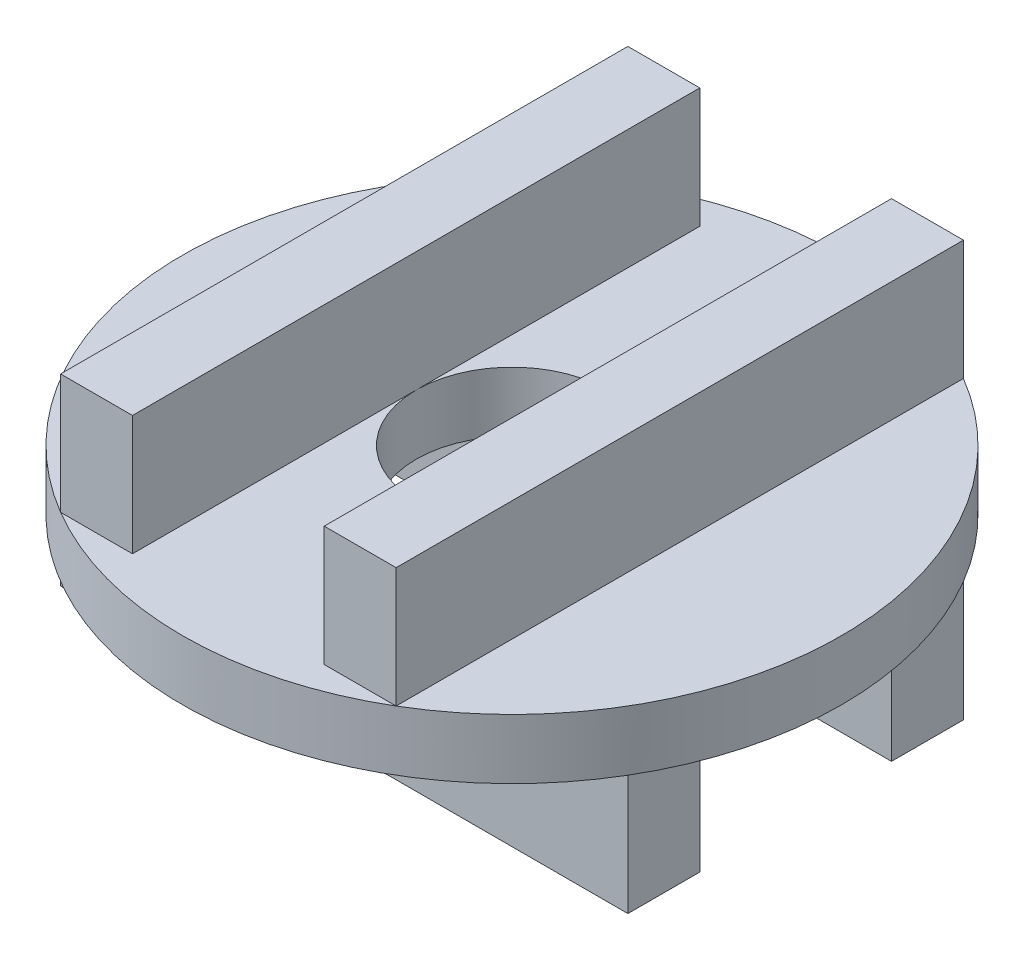
ISO-10303-21;
HEADER;
FILE_DESCRIPTION(('STEP AP214'),'2;1');
FILE_NAME('part.step','',(''),(''),'','','');
FILE_SCHEMA(('AUTOMOTIVE_DESIGN { 1 0 10303 214 1 1 1 1 }'));
ENDSEC;
DATA;
#1=APPLICATION_CONTEXT('core data for automotive mechanical design processes');
#2=APPLICATION_PROTOCOL_DEFINITION('international standard','automotive_design',2000,#1);
#3=PRODUCT_CONTEXT('',#1,'mechanical');
#4=PRODUCT('Part','Part','',(#3));
#5=PRODUCT_RELATED_PRODUCT_CATEGORY('part','',(#4));
#6=PRODUCT_DEFINITION_FORMATION('','',#4);
#7=PRODUCT_DEFINITION_CONTEXT('part definition',#1,'design');
#8=PRODUCT_DEFINITION('design','',#6,#7);
#9=PRODUCT_DEFINITION_SHAPE('','',#8);
#10=(LENGTH_UNIT() NAMED_UNIT(*) SI_UNIT(.MILLI.,.METRE.));
#11=(NAMED_UNIT(*) PLANE_ANGLE_UNIT() SI_UNIT($,.RADIAN.));
#12=(NAMED_UNIT(*) SI_UNIT($,.STERADIAN.) SOLID_ANGLE_UNIT());
#13=UNCERTAINTY_MEASURE_WITH_UNIT(LENGTH_MEASURE(1.E-05),#10,'distance_accuracy_value','');
#14=(GEOMETRIC_REPRESENTATION_CONTEXT(3) GLOBAL_UNCERTAINTY_ASSIGNED_CONTEXT((#13)) GLOBAL_UNIT_ASSIGNED_CONTEXT((#10,
#11,#12)) REPRESENTATION_CONTEXT('',''));
#15=CARTESIAN_POINT('',(0.,0.,0.));
#16=DIRECTION('',(0.,0.,1.));
#17=DIRECTION('',(1.,0.,0.));
#18=AXIS2_PLACEMENT_3D('',#15,#16,#17);
#19=CARTESIAN_POINT('',(0.,0.,0.));
#20=DIRECTION('',(0.,1.,0.));
#21=DIRECTION('',(0.,0.,1.));
#22=AXIS2_PLACEMENT_3D('',#19,#20,#21);
#23=PLANE('',#22);
#24=CARTESIAN_POINT('',(0.,0.,0.));
#25=DIRECTION('',(0.,1.,0.));
#26=DIRECTION('',(0.,0.,1.));
#27=AXIS2_PLACEMENT_3D('',#24,#25,#26);
#28=CIRCLE('',#27,55.);
#29=CARTESIAN_POINT('',(-47.3392015141785,0.,28.));
#30=VERTEX_POINT('',#29);
#31=CARTESIAN_POINT('',(47.3392015141785,0.,28.));
#32=VERTEX_POINT('',#31);
#33=EDGE_CURVE('E313',#30,#32,#28,.T.);
#34=ORIENTED_EDGE('',*,*,#33,.F.);
#35=DIRECTION('',(1.,0.,0.));
#36=VECTOR('',#35,1.);
#37=CARTESIAN_POINT('',(0.,0.,28.));
#38=LINE('',#37,#36);
#39=EDGE_CURVE('E177',#30,#32,#38,.T.);
#40=ORIENTED_EDGE('',*,*,#39,.T.);
#41=EDGE_LOOP('',(#34,#40));
#42=FACE_BOUND('',#41,.T.);
#43=ADVANCED_FACE('F43',(#42),#23,.F.);
#44=CARTESIAN_POINT('',(47.3392015141785,0.,-28.));
#45=VERTEX_POINT('',#44);
#46=EDGE_CURVE('E50',#32,#45,#28,.T.);
#47=ORIENTED_EDGE('',*,*,#46,.F.);
#48=DIRECTION('',(0.,0.,-1.));
#49=VECTOR('',#48,1.);
#50=CARTESIAN_POINT('',(47.3392015141785,0.,0.));
#51=LINE('',#50,#49);
#52=CARTESIAN_POINT('',(47.3392015141785,0.,16.));
#53=VERTEX_POINT('',#52);
#54=EDGE_CURVE('E61',#32,#53,#51,.T.);
#55=ORIENTED_EDGE('',*,*,#54,.T.);
#56=DIRECTION('',(-1.,0.,0.));
#57=VECTOR('',#56,1.);
#58=CARTESIAN_POINT('',(0.,0.,16.));
#59=LINE('',#58,#57);
#60=CARTESIAN_POINT('',(0.,0.,16.));
#61=VERTEX_POINT('',#60);
#62=EDGE_CURVE('E53',#53,#61,#59,.T.);
#63=ORIENTED_EDGE('',*,*,#62,.T.);
#64=CARTESIAN_POINT('',(0.,0.,0.));
#65=DIRECTION('',(0.,1.,0.));
#66=DIRECTION('',(0.,0.,1.));
#67=AXIS2_PLACEMENT_3D('',#64,#65,#66);
#68=CIRCLE('',#67,16.);
#69=CARTESIAN_POINT('',(0.,0.,-16.));
#70=VERTEX_POINT('',#69);
#71=EDGE_CURVE('E311',#61,#70,#68,.T.);
#72=ORIENTED_EDGE('',*,*,#71,.T.);
#73=DIRECTION('',(-1.,0.,0.));
#74=VECTOR('',#73,1.);
#75=CARTESIAN_POINT('',(0.,0.,-16.));
#76=LINE('',#75,#74);
#77=CARTESIAN_POINT('',(47.3392015141785,0.,-16.));
#78=VERTEX_POINT('',#77);
#79=EDGE_CURVE('E216',#78,#70,#76,.T.);
#80=ORIENTED_EDGE('',*,*,#79,.F.);
#81=DIRECTION('',(0.,0.,1.));
#82=VECTOR('',#81,1.);
#83=CARTESIAN_POINT('',(47.3392015141785,0.,0.));
#84=LINE('',#83,#82);
#85=EDGE_CURVE('E230',#45,#78,#84,.T.);
#86=ORIENTED_EDGE('',*,*,#85,.F.);
#87=EDGE_LOOP('',(#47,#55,#63,#72,#80,#86));
#88=FACE_BOUND('',#87,.T.);
#89=ADVANCED_FACE('F341',(#88),#23,.F.);
#90=EDGE_CURVE('E277',#70,#61,#68,.T.);
#91=ORIENTED_EDGE('',*,*,#90,.T.);
#92=CARTESIAN_POINT('',(-47.3392015141785,0.,16.));
#93=VERTEX_POINT('',#92);
#94=EDGE_CURVE('E11',#61,#93,#59,.T.);
#95=ORIENTED_EDGE('',*,*,#94,.T.);
#96=DIRECTION('',(0.,0.,-1.));
#97=VECTOR('',#96,1.);
#98=CARTESIAN_POINT('',(-47.3392015141785,0.,0.));
#99=LINE('',#98,#97);
#100=EDGE_CURVE('E202',#30,#93,#99,.T.);
#101=ORIENTED_EDGE('',*,*,#100,.F.);
#102=CARTESIAN_POINT('',(-47.3392015141785,0.,-28.));
#103=VERTEX_POINT('',#102);
#104=EDGE_CURVE('E331',#103,#30,#28,.T.);
#105=ORIENTED_EDGE('',*,*,#104,.F.);
#106=DIRECTION('',(0.,0.,1.));
#107=VECTOR('',#106,1.);
#108=CARTESIAN_POINT('',(-47.3392015141785,0.,0.));
#109=LINE('',#108,#107);
#110=CARTESIAN_POINT('',(-47.3392015141785,0.,-16.));
#111=VERTEX_POINT('',#110);
#112=EDGE_CURVE('E68',#103,#111,#109,.T.);
#113=ORIENTED_EDGE('',*,*,#112,.T.);
#114=EDGE_CURVE('E55',#70,#111,#76,.T.);
#115=ORIENTED_EDGE('',*,*,#114,.F.);
#116=EDGE_LOOP('',(#91,#95,#101,#105,#113,#115));
#117=FACE_BOUND('',#116,.T.);
#118=ADVANCED_FACE('F337',(#117),#23,.F.);
#119=DIRECTION('',(1.,0.,0.));
#120=VECTOR('',#119,1.);
#121=CARTESIAN_POINT('',(0.,0.,-28.));
#122=LINE('',#121,#120);
#123=EDGE_CURVE('E221',#103,#45,#122,.T.);
#124=ORIENTED_EDGE('',*,*,#123,.F.);
#125=EDGE_CURVE('E328',#45,#103,#28,.T.);
#126=ORIENTED_EDGE('',*,*,#125,.F.);
#127=EDGE_LOOP('',(#124,#126));
#128=FACE_BOUND('',#127,.T.);
#129=ADVANCED_FACE('F345',(#128),#23,.F.);
#130=CARTESIAN_POINT('',(0.,10.,0.));
#131=DIRECTION('',(0.,1.,0.));
#132=DIRECTION('',(0.,0.,1.));
#133=AXIS2_PLACEMENT_3D('',#130,#131,#132);
#134=PLANE('',#133);
#135=DIRECTION('',(1.,0.,0.));
#136=VECTOR('',#135,1.);
#137=CARTESIAN_POINT('',(0.,10.,-47.3392015141785));
#138=LINE('',#137,#136);
#139=CARTESIAN_POINT('',(-28.,10.,-47.3392015141785));
#140=VERTEX_POINT('',#139);
#141=CARTESIAN_POINT('',(-16.,10.,-47.3392015141785));
#142=VERTEX_POINT('',#141);
#143=EDGE_CURVE('E256',#140,#142,#138,.T.);
#144=ORIENTED_EDGE('',*,*,#143,.T.);
#145=DIRECTION('',(0.,0.,1.));
#146=VECTOR('',#145,1.);
#147=CARTESIAN_POINT('',(-16.,10.,0.));
#148=LINE('',#147,#146);
#149=CARTESIAN_POINT('',(-16.,10.,0.));
#150=VERTEX_POINT('',#149);
#151=EDGE_CURVE('E254',#142,#150,#148,.T.);
#152=ORIENTED_EDGE('',*,*,#151,.T.);
#153=CARTESIAN_POINT('',(0.,10.,0.));
#154=DIRECTION('',(0.,1.,0.));
#155=DIRECTION('',(0.,0.,1.));
#156=AXIS2_PLACEMENT_3D('',#153,#154,#155);
#157=CIRCLE('',#156,16.);
#158=CARTESIAN_POINT('',(16.,10.,0.));
#159=VERTEX_POINT('',#158);
#160=EDGE_CURVE('E306',#159,#150,#157,.T.);
#161=ORIENTED_EDGE('',*,*,#160,.F.);
#162=DIRECTION('',(0.,0.,-1.));
#163=VECTOR('',#162,1.);
#164=CARTESIAN_POINT('',(16.,10.,0.));
#165=LINE('',#164,#163);
#166=CARTESIAN_POINT('',(16.,10.,-47.3392015141785));
#167=VERTEX_POINT('',#166);
#168=EDGE_CURVE('E291',#159,#167,#165,.T.);
#169=ORIENTED_EDGE('',*,*,#168,.T.);
#170=DIRECTION('',(-1.,0.,0.));
#171=VECTOR('',#170,1.);
#172=CARTESIAN_POINT('',(0.,10.,-47.3392015141785));
#173=LINE('',#172,#171);
#174=CARTESIAN_POINT('',(28.,10.,-47.3392015141785));
#175=VERTEX_POINT('',#174);
#176=EDGE_CURVE('E281',#175,#167,#173,.T.);
#177=ORIENTED_EDGE('',*,*,#176,.F.);
#178=CARTESIAN_POINT('',(0.,10.,0.));
#179=DIRECTION('',(0.,1.,0.));
#180=DIRECTION('',(0.,0.,1.));
#181=AXIS2_PLACEMENT_3D('',#178,#179,#180);
#182=CIRCLE('',#181,55.);
#183=EDGE_CURVE('E320',#175,#140,#182,.T.);
#184=ORIENTED_EDGE('',*,*,#183,.T.);
#185=EDGE_LOOP('',(#144,#152,#161,#169,#177,#184));
#186=FACE_BOUND('',#185,.T.);
#187=ADVANCED_FACE('F348',(#186),#134,.T.);
#188=EDGE_CURVE('E315',#150,#159,#157,.T.);
#189=ORIENTED_EDGE('',*,*,#188,.F.);
#190=CARTESIAN_POINT('',(-16.,10.,47.3392015141785));
#191=VERTEX_POINT('',#190);
#192=EDGE_CURVE('E257',#150,#191,#148,.T.);
#193=ORIENTED_EDGE('',*,*,#192,.T.);
#194=DIRECTION('',(1.,0.,0.));
#195=VECTOR('',#194,1.);
#196=CARTESIAN_POINT('',(0.,10.,47.3392015141785));
#197=LINE('',#196,#195);
#198=CARTESIAN_POINT('',(-28.,10.,47.3392015141785));
#199=VERTEX_POINT('',#198);
#200=EDGE_CURVE('E249',#199,#191,#197,.T.);
#201=ORIENTED_EDGE('',*,*,#200,.F.);
#202=CARTESIAN_POINT('',(28.,10.,47.3392015141785));
#203=VERTEX_POINT('',#202);
#204=EDGE_CURVE('E318',#199,#203,#182,.T.);
#205=ORIENTED_EDGE('',*,*,#204,.T.);
#206=DIRECTION('',(-1.,0.,0.));
#207=VECTOR('',#206,1.);
#208=CARTESIAN_POINT('',(0.,10.,47.3392015141785));
#209=LINE('',#208,#207);
#210=CARTESIAN_POINT('',(16.,10.,47.3392015141785));
#211=VERTEX_POINT('',#210);
#212=EDGE_CURVE('E295',#203,#211,#209,.T.);
#213=ORIENTED_EDGE('',*,*,#212,.T.);
#214=EDGE_CURVE('E181',#211,#159,#165,.T.);
#215=ORIENTED_EDGE('',*,*,#214,.T.);
#216=EDGE_LOOP('',(#189,#193,#201,#205,#213,#215));
#217=FACE_BOUND('',#216,.T.);
#218=ADVANCED_FACE('F356',(#217),#134,.T.);
#219=EDGE_CURVE('E323',#140,#199,#182,.T.);
#220=ORIENTED_EDGE('',*,*,#219,.T.);
#221=DIRECTION('',(0.,0.,-1.));
#222=VECTOR('',#221,1.);
#223=CARTESIAN_POINT('',(-28.,10.,0.));
#224=LINE('',#223,#222);
#225=EDGE_CURVE('E263',#199,#140,#224,.T.);
#226=ORIENTED_EDGE('',*,*,#225,.T.);
#227=EDGE_LOOP('',(#220,#226));
#228=FACE_BOUND('',#227,.T.);
#229=ADVANCED_FACE('F394',(#228),#134,.T.);
#230=EDGE_CURVE('E312',#203,#175,#182,.T.);
#231=ORIENTED_EDGE('',*,*,#230,.T.);
#232=DIRECTION('',(0.,0.,1.));
#233=VECTOR('',#232,1.);
#234=CARTESIAN_POINT('',(28.,10.,0.));
#235=LINE('',#234,#233);
#236=EDGE_CURVE('E296',#175,#203,#235,.T.);
#237=ORIENTED_EDGE('',*,*,#236,.T.);
#238=EDGE_LOOP('',(#231,#237));
#239=FACE_BOUND('',#238,.T.);
#240=ADVANCED_FACE('F358',(#239),#134,.T.);
#241=CARTESIAN_POINT('',(0.,10.,0.));
#242=DIRECTION('',(0.,-1.,0.));
#243=DIRECTION('',(0.,0.,-1.));
#244=AXIS2_PLACEMENT_3D('',#241,#242,#243);
#245=CYLINDRICAL_SURFACE('',#244,55.);
#246=ORIENTED_EDGE('',*,*,#230,.F.);
#247=ORIENTED_EDGE('',*,*,#204,.F.);
#248=ORIENTED_EDGE('',*,*,#219,.F.);
#249=ORIENTED_EDGE('',*,*,#183,.F.);
#250=EDGE_LOOP('',(#246,#247,#248,#249));
#251=FACE_BOUND('',#250,.T.);
#252=ORIENTED_EDGE('',*,*,#46,.T.);
#253=ORIENTED_EDGE('',*,*,#125,.T.);
#254=ORIENTED_EDGE('',*,*,#104,.T.);
#255=ORIENTED_EDGE('',*,*,#33,.T.);
#256=EDGE_LOOP('',(#252,#253,#254,#255));
#257=FACE_BOUND('',#256,.T.);
#258=ADVANCED_FACE('F44',(#251,#257),#245,.T.);
#259=CARTESIAN_POINT('',(0.,10.,0.));
#260=DIRECTION('',(0.,-1.,0.));
#261=DIRECTION('',(0.,0.,-1.));
#262=AXIS2_PLACEMENT_3D('',#259,#260,#261);
#263=CYLINDRICAL_SURFACE('',#262,16.);
#264=ORIENTED_EDGE('',*,*,#160,.T.);
#265=ORIENTED_EDGE('',*,*,#188,.T.);
#266=EDGE_LOOP('',(#264,#265));
#267=FACE_BOUND('',#266,.T.);
#268=ORIENTED_EDGE('',*,*,#71,.F.);
#269=ORIENTED_EDGE('',*,*,#90,.F.);
#270=EDGE_LOOP('',(#268,#269));
#271=FACE_BOUND('',#270,.T.);
#272=ADVANCED_FACE('F400',(#267,#271),#263,.F.);
#273=CARTESIAN_POINT('',(16.,30.,0.));
#274=DIRECTION('',(-1.,0.,0.));
#275=DIRECTION('',(0.,0.,1.));
#276=AXIS2_PLACEMENT_3D('',#273,#274,#275);
#277=PLANE('',#276);
#278=ORIENTED_EDGE('',*,*,#214,.F.);
#279=DIRECTION('',(0.,-1.,0.));
#280=VECTOR('',#279,1.);
#281=CARTESIAN_POINT('',(16.,30.,47.3392015141785));
#282=LINE('',#281,#280);
#283=CARTESIAN_POINT('',(16.,30.,47.3392015141785));
#284=VERTEX_POINT('',#283);
#285=EDGE_CURVE('E259',#284,#211,#282,.T.);
#286=ORIENTED_EDGE('',*,*,#285,.F.);
#287=DIRECTION('',(0.,0.,-1.));
#288=VECTOR('',#287,1.);
#289=CARTESIAN_POINT('',(16.,30.,0.));
#290=LINE('',#289,#288);
#291=CARTESIAN_POINT('',(16.,30.,-47.3392015141785));
#292=VERTEX_POINT('',#291);
#293=EDGE_CURVE('E280',#284,#292,#290,.T.);
#294=ORIENTED_EDGE('',*,*,#293,.T.);
#295=DIRECTION('',(0.,-1.,0.));
#296=VECTOR('',#295,1.);
#297=CARTESIAN_POINT('',(16.,30.,-47.3392015141785));
#298=LINE('',#297,#296);
#299=EDGE_CURVE('E288',#292,#167,#298,.T.);
#300=ORIENTED_EDGE('',*,*,#299,.T.);
#301=ORIENTED_EDGE('',*,*,#168,.F.);
#302=EDGE_LOOP('',(#278,#286,#294,#300,#301));
#303=FACE_BOUND('',#302,.T.);
#304=ADVANCED_FACE('F405',(#303),#277,.T.);
#305=CARTESIAN_POINT('',(0.,30.,47.3392015141785));
#306=DIRECTION('',(0.,0.,1.));
#307=DIRECTION('',(1.,0.,0.));
#308=AXIS2_PLACEMENT_3D('',#305,#306,#307);
#309=PLANE('',#308);
#310=ORIENTED_EDGE('',*,*,#212,.F.);
#311=DIRECTION('',(0.,-1.,0.));
#312=VECTOR('',#311,1.);
#313=CARTESIAN_POINT('',(28.,30.,47.3392015141785));
#314=LINE('',#313,#312);
#315=CARTESIAN_POINT('',(28.,30.,47.3392015141785));
#316=VERTEX_POINT('',#315);
#317=EDGE_CURVE('E303',#316,#203,#314,.T.);
#318=ORIENTED_EDGE('',*,*,#317,.F.);
#319=DIRECTION('',(-1.,0.,0.));
#320=VECTOR('',#319,1.);
#321=CARTESIAN_POINT('',(0.,30.,47.3392015141785));
#322=LINE('',#321,#320);
#323=EDGE_CURVE('E278',#316,#284,#322,.T.);
#324=ORIENTED_EDGE('',*,*,#323,.T.);
#325=ORIENTED_EDGE('',*,*,#285,.T.);
#326=EDGE_LOOP('',(#310,#318,#324,#325));
#327=FACE_BOUND('',#326,.T.);
#328=ADVANCED_FACE('F411',(#327),#309,.T.);
#329=CARTESIAN_POINT('',(28.,30.,0.));
#330=DIRECTION('',(1.,0.,0.));
#331=DIRECTION('',(0.,0.,-1.));
#332=AXIS2_PLACEMENT_3D('',#329,#330,#331);
#333=PLANE('',#332);
#334=ORIENTED_EDGE('',*,*,#236,.F.);
#335=DIRECTION('',(0.,-1.,0.));
#336=VECTOR('',#335,1.);
#337=CARTESIAN_POINT('',(28.,30.,-47.3392015141785));
#338=LINE('',#337,#336);
#339=CARTESIAN_POINT('',(28.,30.,-47.3392015141785));
#340=VERTEX_POINT('',#339);
#341=EDGE_CURVE('E301',#340,#175,#338,.T.);
#342=ORIENTED_EDGE('',*,*,#341,.F.);
#343=DIRECTION('',(0.,0.,1.));
#344=VECTOR('',#343,1.);
#345=CARTESIAN_POINT('',(28.,30.,0.));
#346=LINE('',#345,#344);
#347=EDGE_CURVE('E283',#340,#316,#346,.T.);
#348=ORIENTED_EDGE('',*,*,#347,.T.);
#349=ORIENTED_EDGE('',*,*,#317,.T.);
#350=EDGE_LOOP('',(#334,#342,#348,#349));
#351=FACE_BOUND('',#350,.T.);
#352=ADVANCED_FACE('F418',(#351),#333,.T.);
#353=CARTESIAN_POINT('',(0.,30.,-47.3392015141785));
#354=DIRECTION('',(0.,0.,1.));
#355=DIRECTION('',(1.,0.,0.));
#356=AXIS2_PLACEMENT_3D('',#353,#354,#355);
#357=PLANE('',#356);
#358=ORIENTED_EDGE('',*,*,#176,.T.);
#359=ORIENTED_EDGE('',*,*,#299,.F.);
#360=DIRECTION('',(-1.,0.,0.));
#361=VECTOR('',#360,1.);
#362=CARTESIAN_POINT('',(0.,30.,-47.3392015141785));
#363=LINE('',#362,#361);
#364=EDGE_CURVE('E286',#340,#292,#363,.T.);
#365=ORIENTED_EDGE('',*,*,#364,.F.);
#366=ORIENTED_EDGE('',*,*,#341,.T.);
#367=EDGE_LOOP('',(#358,#359,#365,#366));
#368=FACE_BOUND('',#367,.T.);
#369=ADVANCED_FACE('F419',(#368),#357,.F.);
#370=CARTESIAN_POINT('',(0.,30.,0.));
#371=DIRECTION('',(0.,1.,0.));
#372=DIRECTION('',(0.,0.,1.));
#373=AXIS2_PLACEMENT_3D('',#370,#371,#372);
#374=PLANE('',#373);
#375=ORIENTED_EDGE('',*,*,#293,.F.);
#376=ORIENTED_EDGE('',*,*,#323,.F.);
#377=ORIENTED_EDGE('',*,*,#347,.F.);
#378=ORIENTED_EDGE('',*,*,#364,.T.);
#379=EDGE_LOOP('',(#375,#376,#377,#378));
#380=FACE_BOUND('',#379,.T.);
#381=ADVANCED_FACE('F424',(#380),#374,.T.);
#382=CARTESIAN_POINT('',(-16.,30.,0.));
#383=DIRECTION('',(1.,0.,0.));
#384=DIRECTION('',(0.,0.,-1.));
#385=AXIS2_PLACEMENT_3D('',#382,#383,#384);
#386=PLANE('',#385);
#387=ORIENTED_EDGE('',*,*,#151,.F.);
#388=DIRECTION('',(0.,-1.,0.));
#389=VECTOR('',#388,1.);
#390=CARTESIAN_POINT('',(-16.,30.,-47.3392015141785));
#391=LINE('',#390,#389);
#392=CARTESIAN_POINT('',(-16.,30.,-47.3392015141785));
#393=VERTEX_POINT('',#392);
#394=EDGE_CURVE('E272',#393,#142,#391,.T.);
#395=ORIENTED_EDGE('',*,*,#394,.F.);
#396=DIRECTION('',(0.,0.,1.));
#397=VECTOR('',#396,1.);
#398=CARTESIAN_POINT('',(-16.,30.,0.));
#399=LINE('',#398,#397);
#400=CARTESIAN_POINT('',(-16.,30.,47.3392015141785));
#401=VERTEX_POINT('',#400);
#402=EDGE_CURVE('E245',#393,#401,#399,.T.);
#403=ORIENTED_EDGE('',*,*,#402,.T.);
#404=DIRECTION('',(0.,-1.,0.));
#405=VECTOR('',#404,1.);
#406=CARTESIAN_POINT('',(-16.,30.,47.3392015141785));
#407=LINE('',#406,#405);
#408=EDGE_CURVE('E255',#401,#191,#407,.T.);
#409=ORIENTED_EDGE('',*,*,#408,.T.);
#410=ORIENTED_EDGE('',*,*,#192,.F.);
#411=EDGE_LOOP('',(#387,#395,#403,#409,#410));
#412=FACE_BOUND('',#411,.T.);
#413=ADVANCED_FACE('F382',(#412),#386,.T.);
#414=CARTESIAN_POINT('',(0.,30.,-47.3392015141785));
#415=DIRECTION('',(0.,0.,-1.));
#416=DIRECTION('',(-1.,0.,0.));
#417=AXIS2_PLACEMENT_3D('',#414,#415,#416);
#418=PLANE('',#417);
#419=ORIENTED_EDGE('',*,*,#143,.F.);
#420=DIRECTION('',(0.,-1.,0.));
#421=VECTOR('',#420,1.);
#422=CARTESIAN_POINT('',(-28.,30.,-47.3392015141785));
#423=LINE('',#422,#421);
#424=CARTESIAN_POINT('',(-28.,30.,-47.3392015141785));
#425=VERTEX_POINT('',#424);
#426=EDGE_CURVE('E271',#425,#140,#423,.T.);
#427=ORIENTED_EDGE('',*,*,#426,.F.);
#428=DIRECTION('',(1.,0.,0.));
#429=VECTOR('',#428,1.);
#430=CARTESIAN_POINT('',(0.,30.,-47.3392015141785));
#431=LINE('',#430,#429);
#432=EDGE_CURVE('E244',#425,#393,#431,.T.);
#433=ORIENTED_EDGE('',*,*,#432,.T.);
#434=ORIENTED_EDGE('',*,*,#394,.T.);
#435=EDGE_LOOP('',(#419,#427,#433,#434));
#436=FACE_BOUND('',#435,.T.);
#437=ADVANCED_FACE('F388',(#436),#418,.T.);
#438=CARTESIAN_POINT('',(-28.,30.,0.));
#439=DIRECTION('',(-1.,0.,0.));
#440=DIRECTION('',(0.,0.,1.));
#441=AXIS2_PLACEMENT_3D('',#438,#439,#440);
#442=PLANE('',#441);
#443=ORIENTED_EDGE('',*,*,#225,.F.);
#444=DIRECTION('',(0.,-1.,0.));
#445=VECTOR('',#444,1.);
#446=CARTESIAN_POINT('',(-28.,30.,47.3392015141785));
#447=LINE('',#446,#445);
#448=CARTESIAN_POINT('',(-28.,30.,47.3392015141785));
#449=VERTEX_POINT('',#448);
#450=EDGE_CURVE('E267',#449,#199,#447,.T.);
#451=ORIENTED_EDGE('',*,*,#450,.F.);
#452=DIRECTION('',(0.,0.,-1.));
#453=VECTOR('',#452,1.);
#454=CARTESIAN_POINT('',(-28.,30.,0.));
#455=LINE('',#454,#453);
#456=EDGE_CURVE('E248',#449,#425,#455,.T.);
#457=ORIENTED_EDGE('',*,*,#456,.T.);
#458=ORIENTED_EDGE('',*,*,#426,.T.);
#459=EDGE_LOOP('',(#443,#451,#457,#458));
#460=FACE_BOUND('',#459,.T.);
#461=ADVANCED_FACE('F433',(#460),#442,.T.);
#462=CARTESIAN_POINT('',(0.,30.,47.3392015141785));
#463=DIRECTION('',(0.,0.,-1.));
#464=DIRECTION('',(-1.,0.,0.));
#465=AXIS2_PLACEMENT_3D('',#462,#463,#464);
#466=PLANE('',#465);
#467=ORIENTED_EDGE('',*,*,#200,.T.);
#468=ORIENTED_EDGE('',*,*,#408,.F.);
#469=DIRECTION('',(1.,0.,0.));
#470=VECTOR('',#469,1.);
#471=CARTESIAN_POINT('',(0.,30.,47.3392015141785));
#472=LINE('',#471,#470);
#473=EDGE_CURVE('E252',#449,#401,#472,.T.);
#474=ORIENTED_EDGE('',*,*,#473,.F.);
#475=ORIENTED_EDGE('',*,*,#450,.T.);
#476=EDGE_LOOP('',(#467,#468,#474,#475));
#477=FACE_BOUND('',#476,.T.);
#478=ADVANCED_FACE('F436',(#477),#466,.F.);
#479=CARTESIAN_POINT('',(0.,30.,0.));
#480=DIRECTION('',(0.,1.,0.));
#481=DIRECTION('',(0.,0.,1.));
#482=AXIS2_PLACEMENT_3D('',#479,#480,#481);
#483=PLANE('',#482);
#484=ORIENTED_EDGE('',*,*,#402,.F.);
#485=ORIENTED_EDGE('',*,*,#432,.F.);
#486=ORIENTED_EDGE('',*,*,#456,.F.);
#487=ORIENTED_EDGE('',*,*,#473,.T.);
#488=EDGE_LOOP('',(#484,#485,#486,#487));
#489=FACE_BOUND('',#488,.T.);
#490=ADVANCED_FACE('F438',(#489),#483,.T.);
#491=CARTESIAN_POINT('',(-47.3392015141785,-20.,0.));
#492=DIRECTION('',(-1.,0.,0.));
#493=DIRECTION('',(0.,0.,1.));
#494=AXIS2_PLACEMENT_3D('',#491,#492,#493);
#495=PLANE('',#494);
#496=ORIENTED_EDGE('',*,*,#112,.F.);
#497=DIRECTION('',(0.,1.,0.));
#498=VECTOR('',#497,1.);
#499=CARTESIAN_POINT('',(-47.3392015141785,-20.,-28.));
#500=LINE('',#499,#498);
#501=CARTESIAN_POINT('',(-47.3392015141785,-20.,-28.));
#502=VERTEX_POINT('',#501);
#503=EDGE_CURVE('E206',#502,#103,#500,.T.);
#504=ORIENTED_EDGE('',*,*,#503,.F.);
#505=DIRECTION('',(0.,0.,1.));
#506=VECTOR('',#505,1.);
#507=CARTESIAN_POINT('',(-47.3392015141785,-20.,0.));
#508=LINE('',#507,#506);
#509=CARTESIAN_POINT('',(-47.3392015141785,-20.,-16.));
#510=VERTEX_POINT('',#509);
#511=EDGE_CURVE('E215',#502,#510,#508,.T.);
#512=ORIENTED_EDGE('',*,*,#511,.T.);
#513=DIRECTION('',(0.,1.,0.));
#514=VECTOR('',#513,1.);
#515=CARTESIAN_POINT('',(-47.3392015141785,-20.,-16.));
#516=LINE('',#515,#514);
#517=EDGE_CURVE('E225',#510,#111,#516,.T.);
#518=ORIENTED_EDGE('',*,*,#517,.T.);
#519=EDGE_LOOP('',(#496,#504,#512,#518));
#520=FACE_BOUND('',#519,.T.);
#521=ADVANCED_FACE('F374',(#520),#495,.T.);
#522=CARTESIAN_POINT('',(0.,-20.,-28.));
#523=DIRECTION('',(0.,0.,1.));
#524=DIRECTION('',(1.,0.,0.));
#525=AXIS2_PLACEMENT_3D('',#522,#523,#524);
#526=PLANE('',#525);
#527=ORIENTED_EDGE('',*,*,#123,.T.);
#528=DIRECTION('',(0.,1.,0.));
#529=VECTOR('',#528,1.);
#530=CARTESIAN_POINT('',(47.3392015141785,-20.,-28.));
#531=LINE('',#530,#529);
#532=CARTESIAN_POINT('',(47.3392015141785,-20.,-28.));
#533=VERTEX_POINT('',#532);
#534=EDGE_CURVE('E240',#533,#45,#531,.T.);
#535=ORIENTED_EDGE('',*,*,#534,.F.);
#536=DIRECTION('',(1.,0.,0.));
#537=VECTOR('',#536,1.);
#538=CARTESIAN_POINT('',(0.,-20.,-28.));
#539=LINE('',#538,#537);
#540=EDGE_CURVE('E214',#502,#533,#539,.T.);
#541=ORIENTED_EDGE('',*,*,#540,.F.);
#542=ORIENTED_EDGE('',*,*,#503,.T.);
#543=EDGE_LOOP('',(#527,#535,#541,#542));
#544=FACE_BOUND('',#543,.T.);
#545=ADVANCED_FACE('F361',(#544),#526,.F.);
#546=CARTESIAN_POINT('',(47.3392015141785,-20.,0.));
#547=DIRECTION('',(-1.,0.,0.));
#548=DIRECTION('',(0.,0.,1.));
#549=AXIS2_PLACEMENT_3D('',#546,#547,#548);
#550=PLANE('',#549);
#551=ORIENTED_EDGE('',*,*,#85,.T.);
#552=DIRECTION('',(0.,1.,0.));
#553=VECTOR('',#552,1.);
#554=CARTESIAN_POINT('',(47.3392015141785,-20.,-16.));
#555=LINE('',#554,#553);
#556=CARTESIAN_POINT('',(47.3392015141785,-20.,-16.));
#557=VERTEX_POINT('',#556);
#558=EDGE_CURVE('E233',#557,#78,#555,.T.);
#559=ORIENTED_EDGE('',*,*,#558,.F.);
#560=DIRECTION('',(0.,0.,1.));
#561=VECTOR('',#560,1.);
#562=CARTESIAN_POINT('',(47.3392015141785,-20.,0.));
#563=LINE('',#562,#561);
#564=EDGE_CURVE('E217',#533,#557,#563,.T.);
#565=ORIENTED_EDGE('',*,*,#564,.F.);
#566=ORIENTED_EDGE('',*,*,#534,.T.);
#567=EDGE_LOOP('',(#551,#559,#565,#566));
#568=FACE_BOUND('',#567,.T.);
#569=ADVANCED_FACE('F370',(#568),#550,.F.);
#570=CARTESIAN_POINT('',(0.,-20.,-16.));
#571=DIRECTION('',(0.,0.,-1.));
#572=DIRECTION('',(-1.,0.,0.));
#573=AXIS2_PLACEMENT_3D('',#570,#571,#572);
#574=PLANE('',#573);
#575=ORIENTED_EDGE('',*,*,#79,.T.);
#576=ORIENTED_EDGE('',*,*,#114,.T.);
#577=ORIENTED_EDGE('',*,*,#517,.F.);
#578=DIRECTION('',(-1.,0.,0.));
#579=VECTOR('',#578,1.);
#580=CARTESIAN_POINT('',(0.,-20.,-16.));
#581=LINE('',#580,#579);
#582=EDGE_CURVE('E219',#557,#510,#581,.T.);
#583=ORIENTED_EDGE('',*,*,#582,.F.);
#584=ORIENTED_EDGE('',*,*,#558,.T.);
#585=EDGE_LOOP('',(#575,#576,#577,#583,#584));
#586=FACE_BOUND('',#585,.T.);
#587=ADVANCED_FACE('F380',(#586),#574,.F.);
#588=CARTESIAN_POINT('',(0.,-20.,0.));
#589=DIRECTION('',(0.,-1.,0.));
#590=DIRECTION('',(0.,0.,-1.));
#591=AXIS2_PLACEMENT_3D('',#588,#589,#590);
#592=PLANE('',#591);
#593=ORIENTED_EDGE('',*,*,#511,.F.);
#594=ORIENTED_EDGE('',*,*,#540,.T.);
#595=ORIENTED_EDGE('',*,*,#564,.T.);
#596=ORIENTED_EDGE('',*,*,#582,.T.);
#597=EDGE_LOOP('',(#593,#594,#595,#596));
#598=FACE_BOUND('',#597,.T.);
#599=ADVANCED_FACE('F375',(#598),#592,.T.);
#600=CARTESIAN_POINT('',(0.,-20.,28.));
#601=DIRECTION('',(0.,0.,1.));
#602=DIRECTION('',(1.,0.,0.));
#603=AXIS2_PLACEMENT_3D('',#600,#601,#602);
#604=PLANE('',#603);
#605=ORIENTED_EDGE('',*,*,#39,.F.);
#606=DIRECTION('',(0.,1.,0.));
#607=VECTOR('',#606,1.);
#608=CARTESIAN_POINT('',(-47.3392015141785,-20.,28.));
#609=LINE('',#608,#607);
#610=CARTESIAN_POINT('',(-47.3392015141785,-20.,28.));
#611=VERTEX_POINT('',#610);
#612=EDGE_CURVE('E172',#611,#30,#609,.T.);
#613=ORIENTED_EDGE('',*,*,#612,.F.);
#614=DIRECTION('',(1.,0.,0.));
#615=VECTOR('',#614,1.);
#616=CARTESIAN_POINT('',(0.,-20.,28.));
#617=LINE('',#616,#615);
#618=CARTESIAN_POINT('',(47.3392015141785,-20.,28.));
#619=VERTEX_POINT('',#618);
#620=EDGE_CURVE('E180',#611,#619,#617,.T.);
#621=ORIENTED_EDGE('',*,*,#620,.T.);
#622=DIRECTION('',(0.,1.,0.));
#623=VECTOR('',#622,1.);
#624=CARTESIAN_POINT('',(47.3392015141785,-20.,28.));
#625=LINE('',#624,#623);
#626=EDGE_CURVE('E201',#619,#32,#625,.T.);
#627=ORIENTED_EDGE('',*,*,#626,.T.);
#628=EDGE_LOOP('',(#605,#613,#621,#627));
#629=FACE_BOUND('',#628,.T.);
#630=ADVANCED_FACE('F174',(#629),#604,.T.);
#631=CARTESIAN_POINT('',(-47.3392015141785,-20.,0.));
#632=DIRECTION('',(1.,0.,0.));
#633=DIRECTION('',(0.,0.,-1.));
#634=AXIS2_PLACEMENT_3D('',#631,#632,#633);
#635=PLANE('',#634);
#636=ORIENTED_EDGE('',*,*,#100,.T.);
#637=DIRECTION('',(0.,1.,0.));
#638=VECTOR('',#637,1.);
#639=CARTESIAN_POINT('',(-47.3392015141785,-20.,16.));
#640=LINE('',#639,#638);
#641=CARTESIAN_POINT('',(-47.3392015141785,-20.,16.));
#642=VERTEX_POINT('',#641);
#643=EDGE_CURVE('E184',#642,#93,#640,.T.);
#644=ORIENTED_EDGE('',*,*,#643,.F.);
#645=DIRECTION('',(0.,0.,-1.));
#646=VECTOR('',#645,1.);
#647=CARTESIAN_POINT('',(-47.3392015141785,-20.,0.));
#648=LINE('',#647,#646);
#649=EDGE_CURVE('E190',#611,#642,#648,.T.);
#650=ORIENTED_EDGE('',*,*,#649,.F.);
#651=ORIENTED_EDGE('',*,*,#612,.T.);
#652=EDGE_LOOP('',(#636,#644,#650,#651));
#653=FACE_BOUND('',#652,.T.);
#654=ADVANCED_FACE('F187',(#653),#635,.F.);
#655=CARTESIAN_POINT('',(0.,-20.,16.));
#656=DIRECTION('',(0.,0.,-1.));
#657=DIRECTION('',(-1.,0.,0.));
#658=AXIS2_PLACEMENT_3D('',#655,#656,#657);
#659=PLANE('',#658);
#660=ORIENTED_EDGE('',*,*,#62,.F.);
#661=DIRECTION('',(0.,1.,0.));
#662=VECTOR('',#661,1.);
#663=CARTESIAN_POINT('',(47.3392015141785,-20.,16.));
#664=LINE('',#663,#662);
#665=CARTESIAN_POINT('',(47.3392015141785,-20.,16.));
#666=VERTEX_POINT('',#665);
#667=EDGE_CURVE('E207',#666,#53,#664,.T.);
#668=ORIENTED_EDGE('',*,*,#667,.F.);
#669=DIRECTION('',(-1.,0.,0.));
#670=VECTOR('',#669,1.);
#671=CARTESIAN_POINT('',(0.,-20.,16.));
#672=LINE('',#671,#670);
#673=EDGE_CURVE('E195',#666,#642,#672,.T.);
#674=ORIENTED_EDGE('',*,*,#673,.T.);
#675=ORIENTED_EDGE('',*,*,#643,.T.);
#676=ORIENTED_EDGE('',*,*,#94,.F.);
#677=EDGE_LOOP('',(#660,#668,#674,#675,#676));
#678=FACE_BOUND('',#677,.T.);
#679=ADVANCED_FACE('F460',(#678),#659,.T.);
#680=CARTESIAN_POINT('',(47.3392015141785,-20.,0.));
#681=DIRECTION('',(1.,0.,0.));
#682=DIRECTION('',(0.,0.,-1.));
#683=AXIS2_PLACEMENT_3D('',#680,#681,#682);
#684=PLANE('',#683);
#685=ORIENTED_EDGE('',*,*,#54,.F.);
#686=ORIENTED_EDGE('',*,*,#626,.F.);
#687=DIRECTION('',(0.,0.,-1.));
#688=VECTOR('',#687,1.);
#689=CARTESIAN_POINT('',(47.3392015141785,-20.,0.));
#690=LINE('',#689,#688);
#691=EDGE_CURVE('E197',#619,#666,#690,.T.);
#692=ORIENTED_EDGE('',*,*,#691,.T.);
#693=ORIENTED_EDGE('',*,*,#667,.T.);
#694=EDGE_LOOP('',(#685,#686,#692,#693));
#695=FACE_BOUND('',#694,.T.);
#696=ADVANCED_FACE('F458',(#695),#684,.T.);
#697=CARTESIAN_POINT('',(0.,-20.,0.));
#698=DIRECTION('',(0.,-1.,0.));
#699=DIRECTION('',(0.,0.,-1.));
#700=AXIS2_PLACEMENT_3D('',#697,#698,#699);
#701=PLANE('',#700);
#702=ORIENTED_EDGE('',*,*,#620,.F.);
#703=ORIENTED_EDGE('',*,*,#649,.T.);
#704=ORIENTED_EDGE('',*,*,#673,.F.);
#705=ORIENTED_EDGE('',*,*,#691,.F.);
#706=EDGE_LOOP('',(#702,#703,#704,#705));
#707=FACE_BOUND('',#706,.T.);
#708=ADVANCED_FACE('F192',(#707),#701,.T.);
#709=CLOSED_SHELL('',(#43,#89,#118,#129,#187,#218,#229,#240,#258,#272,#304,#328,#352,#369,#381,
#413,#437,#461,#478,#490,#521,#545,#569,#587,#599,#630,#654,#679,#696,#708));
#710=MANIFOLD_SOLID_BREP('B2',#709);
#711=ADVANCED_BREP_SHAPE_REPRESENTATION('',(#18,#710),#14);
#712=SHAPE_DEFINITION_REPRESENTATION(#9,#711);
ENDSEC;
END-ISO-10303-21;
